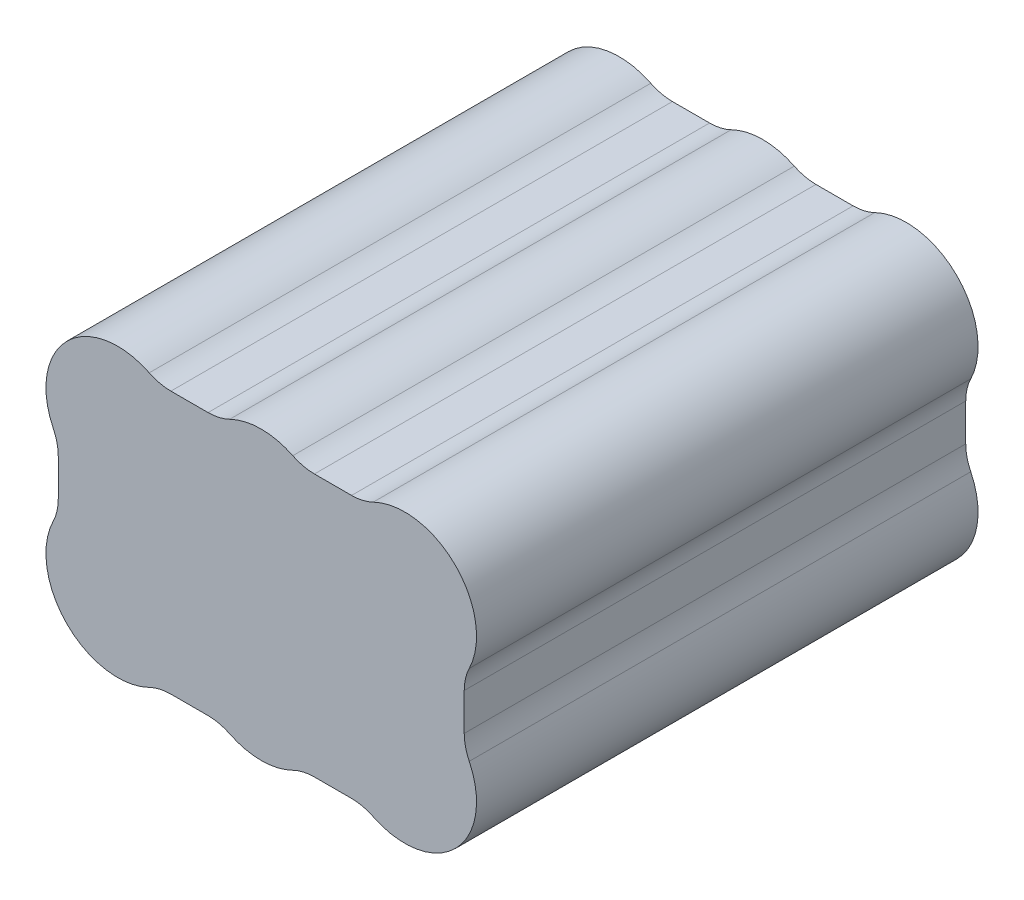
ISO-10303-21;
HEADER;
FILE_DESCRIPTION(('STEP AP214'),'2;1');
FILE_NAME('part.step','',(''),(''),'','','');
FILE_SCHEMA(('AUTOMOTIVE_DESIGN { 1 0 10303 214 1 1 1 1 }'));
ENDSEC;
DATA;
#1=APPLICATION_CONTEXT('core data for automotive mechanical design processes');
#2=APPLICATION_PROTOCOL_DEFINITION('international standard','automotive_design',2000,#1);
#3=PRODUCT_CONTEXT('',#1,'mechanical');
#4=PRODUCT('Part','Part','',(#3));
#5=PRODUCT_RELATED_PRODUCT_CATEGORY('part','',(#4));
#6=PRODUCT_DEFINITION_FORMATION('','',#4);
#7=PRODUCT_DEFINITION_CONTEXT('part definition',#1,'design');
#8=PRODUCT_DEFINITION('design','',#6,#7);
#9=PRODUCT_DEFINITION_SHAPE('','',#8);
#10=(LENGTH_UNIT() NAMED_UNIT(*) SI_UNIT(.MILLI.,.METRE.));
#11=(NAMED_UNIT(*) PLANE_ANGLE_UNIT() SI_UNIT($,.RADIAN.));
#12=(NAMED_UNIT(*) SI_UNIT($,.STERADIAN.) SOLID_ANGLE_UNIT());
#13=UNCERTAINTY_MEASURE_WITH_UNIT(LENGTH_MEASURE(1.E-05),#10,'distance_accuracy_value','');
#14=(GEOMETRIC_REPRESENTATION_CONTEXT(3) GLOBAL_UNCERTAINTY_ASSIGNED_CONTEXT((#13)) GLOBAL_UNIT_ASSIGNED_CONTEXT((#10,
#11,#12)) REPRESENTATION_CONTEXT('',''));
#15=CARTESIAN_POINT('',(0.,0.,0.));
#16=DIRECTION('',(0.,0.,1.));
#17=DIRECTION('',(1.,0.,0.));
#18=AXIS2_PLACEMENT_3D('',#15,#16,#17);
#19=CARTESIAN_POINT('',(3173.91030440519,2839.53220099449,64.6557));
#20=DIRECTION('',(0.,0.,-1.));
#21=DIRECTION('',(-1.,0.,0.));
#22=AXIS2_PLACEMENT_3D('',#19,#20,#21);
#23=CYLINDRICAL_SURFACE('',#22,6.35000000000014);
#24=CARTESIAN_POINT('',(3173.91030440519,2839.53220099449,0.));
#25=DIRECTION('',(0.,0.,-1.));
#26=DIRECTION('',(1.,0.,0.));
#27=AXIS2_PLACEMENT_3D('',#24,#25,#26);
#28=CIRCLE('',#27,6.35000000000014);
#29=CARTESIAN_POINT('',(3173.91030440519,2845.88220099449,0.));
#30=VERTEX_POINT('',#29);
#31=CARTESIAN_POINT('',(3176.70103455306,2845.23608784836,0.));
#32=VERTEX_POINT('',#31);
#33=EDGE_CURVE('E225',#30,#32,#28,.T.);
#34=ORIENTED_EDGE('',*,*,#33,.T.);
#35=DIRECTION('',(0.,0.,-1.));
#36=VECTOR('',#35,1.);
#37=CARTESIAN_POINT('',(3176.70103455306,2845.23608784836,64.6557));
#38=LINE('',#37,#36);
#39=CARTESIAN_POINT('',(3176.70103455306,2845.23608784836,64.6557));
#40=VERTEX_POINT('',#39);
#41=EDGE_CURVE('E11',#40,#32,#38,.T.);
#42=ORIENTED_EDGE('',*,*,#41,.F.);
#43=CARTESIAN_POINT('',(3173.91030440519,2839.53220099449,64.6557));
#44=DIRECTION('',(0.,0.,-1.));
#45=DIRECTION('',(1.,0.,0.));
#46=AXIS2_PLACEMENT_3D('',#43,#44,#45);
#47=CIRCLE('',#46,6.35000000000014);
#48=CARTESIAN_POINT('',(3173.91030440519,2845.88220099449,64.6557));
#49=VERTEX_POINT('',#48);
#50=EDGE_CURVE('E271',#49,#40,#47,.T.);
#51=ORIENTED_EDGE('',*,*,#50,.F.);
#52=DIRECTION('',(0.,0.,-1.));
#53=VECTOR('',#52,1.);
#54=CARTESIAN_POINT('',(3173.91030440519,2845.88220099449,64.6557));
#55=LINE('',#54,#53);
#56=EDGE_CURVE('E221',#49,#30,#55,.T.);
#57=ORIENTED_EDGE('',*,*,#56,.T.);
#58=EDGE_LOOP('',(#34,#42,#51,#57));
#59=FACE_BOUND('',#58,.T.);
#60=ADVANCED_FACE('F33',(#59),#23,.F.);
#61=CARTESIAN_POINT('',(3180.7671283785,2853.54665099446,64.6557));
#62=DIRECTION('',(0.,0.,-1.));
#63=DIRECTION('',(-1.,0.,0.));
#64=AXIS2_PLACEMENT_3D('',#61,#62,#63);
#65=CYLINDRICAL_SURFACE('',#64,9.2519500000007);
#66=CARTESIAN_POINT('',(3180.7671283785,2853.54665099446,0.));
#67=DIRECTION('',(0.,0.,1.));
#68=DIRECTION('',(1.,0.,0.));
#69=AXIS2_PLACEMENT_3D('',#66,#67,#68);
#70=CIRCLE('',#69,9.2519500000007);
#71=CARTESIAN_POINT('',(3189.07769152459,2857.6127448199,0.));
#72=VERTEX_POINT('',#71);
#73=EDGE_CURVE('E228',#32,#72,#70,.T.);
#74=ORIENTED_EDGE('',*,*,#73,.T.);
#75=DIRECTION('',(0.,0.,-1.));
#76=VECTOR('',#75,1.);
#77=CARTESIAN_POINT('',(3189.07769152459,2857.6127448199,64.6557));
#78=LINE('',#77,#76);
#79=CARTESIAN_POINT('',(3189.07769152459,2857.6127448199,64.6557));
#80=VERTEX_POINT('',#79);
#81=EDGE_CURVE('E41',#80,#72,#78,.T.);
#82=ORIENTED_EDGE('',*,*,#81,.F.);
#83=CARTESIAN_POINT('',(3180.7671283785,2853.54665099446,64.6557));
#84=DIRECTION('',(0.,0.,1.));
#85=DIRECTION('',(1.,0.,0.));
#86=AXIS2_PLACEMENT_3D('',#83,#84,#85);
#87=CIRCLE('',#86,9.2519500000007);
#88=EDGE_CURVE('E140',#40,#80,#87,.T.);
#89=ORIENTED_EDGE('',*,*,#88,.F.);
#90=ORIENTED_EDGE('',*,*,#41,.T.);
#91=EDGE_LOOP('',(#74,#82,#89,#90));
#92=FACE_BOUND('',#91,.T.);
#93=ADVANCED_FACE('F409',(#92),#65,.T.);
#94=CARTESIAN_POINT('',(3194.78157837847,2860.40347496777,64.6557));
#95=DIRECTION('',(0.,0.,-1.));
#96=DIRECTION('',(-1.,0.,0.));
#97=AXIS2_PLACEMENT_3D('',#94,#95,#96);
#98=CYLINDRICAL_SURFACE('',#97,6.34999999999982);
#99=CARTESIAN_POINT('',(3194.78157837847,2860.40347496777,0.));
#100=DIRECTION('',(0.,0.,-1.));
#101=DIRECTION('',(1.,0.,0.));
#102=AXIS2_PLACEMENT_3D('',#99,#100,#101);
#103=CIRCLE('',#102,6.34999999999982);
#104=CARTESIAN_POINT('',(3188.43157837847,2860.40347496777,0.));
#105=VERTEX_POINT('',#104);
#106=EDGE_CURVE('E230',#72,#105,#103,.T.);
#107=ORIENTED_EDGE('',*,*,#106,.T.);
#108=DIRECTION('',(0.,0.,-1.));
#109=VECTOR('',#108,1.);
#110=CARTESIAN_POINT('',(3188.43157837847,2860.40347496777,64.6557));
#111=LINE('',#110,#109);
#112=CARTESIAN_POINT('',(3188.43157837847,2860.40347496777,64.6557));
#113=VERTEX_POINT('',#112);
#114=EDGE_CURVE('E326',#113,#105,#111,.T.);
#115=ORIENTED_EDGE('',*,*,#114,.F.);
#116=CARTESIAN_POINT('',(3194.78157837847,2860.40347496777,64.6557));
#117=DIRECTION('',(0.,0.,-1.));
#118=DIRECTION('',(1.,0.,0.));
#119=AXIS2_PLACEMENT_3D('',#116,#117,#118);
#120=CIRCLE('',#119,6.34999999999982);
#121=EDGE_CURVE('E334',#80,#113,#120,.T.);
#122=ORIENTED_EDGE('',*,*,#121,.F.);
#123=ORIENTED_EDGE('',*,*,#81,.T.);
#124=EDGE_LOOP('',(#107,#115,#122,#123));
#125=FACE_BOUND('',#124,.T.);
#126=ADVANCED_FACE('F332',(#125),#98,.F.);
#127=CARTESIAN_POINT('',(3188.43157837847,2860.40347496777,64.6557));
#128=DIRECTION('',(-1.,0.,0.));
#129=DIRECTION('',(0.,-1.,0.));
#130=AXIS2_PLACEMENT_3D('',#127,#128,#129);
#131=PLANE('',#130);
#132=DIRECTION('',(0.,1.,0.));
#133=VECTOR('',#132,1.);
#134=CARTESIAN_POINT('',(3188.43157837847,2860.40347496777,0.));
#135=LINE('',#134,#133);
#136=CARTESIAN_POINT('',(3188.43157837847,2865.19372702114,0.));
#137=VERTEX_POINT('',#136);
#138=EDGE_CURVE('E232',#105,#137,#135,.T.);
#139=ORIENTED_EDGE('',*,*,#138,.T.);
#140=DIRECTION('',(0.,0.,-1.));
#141=VECTOR('',#140,1.);
#142=CARTESIAN_POINT('',(3188.43157837847,2865.19372702114,64.6557));
#143=LINE('',#142,#141);
#144=CARTESIAN_POINT('',(3188.43157837847,2865.19372702114,64.6557));
#145=VERTEX_POINT('',#144);
#146=EDGE_CURVE('E323',#145,#137,#143,.T.);
#147=ORIENTED_EDGE('',*,*,#146,.F.);
#148=DIRECTION('',(0.,1.,0.));
#149=VECTOR('',#148,1.);
#150=CARTESIAN_POINT('',(3188.43157837847,2860.40347496777,64.6557));
#151=LINE('',#150,#149);
#152=EDGE_CURVE('E352',#113,#145,#151,.T.);
#153=ORIENTED_EDGE('',*,*,#152,.F.);
#154=ORIENTED_EDGE('',*,*,#114,.T.);
#155=EDGE_LOOP('',(#139,#147,#153,#154));
#156=FACE_BOUND('',#155,.T.);
#157=ADVANCED_FACE('F343',(#156),#131,.F.);
#158=CARTESIAN_POINT('',(3194.78157837847,2865.19372702114,64.6557));
#159=DIRECTION('',(0.,0.,-1.));
#160=DIRECTION('',(-1.,0.,0.));
#161=AXIS2_PLACEMENT_3D('',#158,#159,#160);
#162=CYLINDRICAL_SURFACE('',#161,6.35000000000002);
#163=CARTESIAN_POINT('',(3194.78157837847,2865.19372702114,0.));
#164=DIRECTION('',(0.,0.,-1.));
#165=DIRECTION('',(1.,0.,0.));
#166=AXIS2_PLACEMENT_3D('',#163,#164,#165);
#167=CIRCLE('',#166,6.35000000000002);
#168=CARTESIAN_POINT('',(3189.07769152459,2867.98445716901,0.));
#169=VERTEX_POINT('',#168);
#170=EDGE_CURVE('E234',#137,#169,#167,.T.);
#171=ORIENTED_EDGE('',*,*,#170,.T.);
#172=DIRECTION('',(0.,0.,-1.));
#173=VECTOR('',#172,1.);
#174=CARTESIAN_POINT('',(3189.07769152459,2867.98445716901,64.6557));
#175=LINE('',#174,#173);
#176=CARTESIAN_POINT('',(3189.07769152459,2867.98445716901,64.6557));
#177=VERTEX_POINT('',#176);
#178=EDGE_CURVE('E320',#177,#169,#175,.T.);
#179=ORIENTED_EDGE('',*,*,#178,.F.);
#180=CARTESIAN_POINT('',(3194.78157837847,2865.19372702114,64.6557));
#181=DIRECTION('',(0.,0.,-1.));
#182=DIRECTION('',(1.,0.,0.));
#183=AXIS2_PLACEMENT_3D('',#180,#181,#182);
#184=CIRCLE('',#183,6.35000000000002);
#185=EDGE_CURVE('E349',#145,#177,#184,.T.);
#186=ORIENTED_EDGE('',*,*,#185,.F.);
#187=ORIENTED_EDGE('',*,*,#146,.T.);
#188=EDGE_LOOP('',(#171,#179,#186,#187));
#189=FACE_BOUND('',#188,.T.);
#190=ADVANCED_FACE('F347',(#189),#162,.F.);
#191=CARTESIAN_POINT('',(3180.7671283785,2872.05055099446,64.6557));
#192=DIRECTION('',(0.,0.,-1.));
#193=DIRECTION('',(-1.,0.,0.));
#194=AXIS2_PLACEMENT_3D('',#191,#192,#193);
#195=CYLINDRICAL_SURFACE('',#194,9.2519500000006);
#196=CARTESIAN_POINT('',(3180.7671283785,2872.05055099446,0.));
#197=DIRECTION('',(0.,0.,1.));
#198=DIRECTION('',(1.,0.,0.));
#199=AXIS2_PLACEMENT_3D('',#196,#197,#198);
#200=CIRCLE('',#199,9.2519500000006);
#201=CARTESIAN_POINT('',(3176.70103455306,2880.36111414055,0.));
#202=VERTEX_POINT('',#201);
#203=EDGE_CURVE('E236',#169,#202,#200,.T.);
#204=ORIENTED_EDGE('',*,*,#203,.T.);
#205=DIRECTION('',(0.,0.,-1.));
#206=VECTOR('',#205,1.);
#207=CARTESIAN_POINT('',(3176.70103455306,2880.36111414055,64.6557));
#208=LINE('',#207,#206);
#209=CARTESIAN_POINT('',(3176.70103455306,2880.36111414055,64.6557));
#210=VERTEX_POINT('',#209);
#211=EDGE_CURVE('E317',#210,#202,#208,.T.);
#212=ORIENTED_EDGE('',*,*,#211,.F.);
#213=CARTESIAN_POINT('',(3180.7671283785,2872.05055099446,64.6557));
#214=DIRECTION('',(0.,0.,1.));
#215=DIRECTION('',(1.,0.,0.));
#216=AXIS2_PLACEMENT_3D('',#213,#214,#215);
#217=CIRCLE('',#216,9.2519500000006);
#218=EDGE_CURVE('E351',#177,#210,#217,.T.);
#219=ORIENTED_EDGE('',*,*,#218,.F.);
#220=ORIENTED_EDGE('',*,*,#178,.T.);
#221=EDGE_LOOP('',(#204,#212,#219,#220));
#222=FACE_BOUND('',#221,.T.);
#223=ADVANCED_FACE('F422',(#222),#195,.T.);
#224=CARTESIAN_POINT('',(3173.91030440519,2886.06500099442,64.6557));
#225=DIRECTION('',(0.,0.,-1.));
#226=DIRECTION('',(-1.,0.,0.));
#227=AXIS2_PLACEMENT_3D('',#224,#225,#226);
#228=CYLINDRICAL_SURFACE('',#227,6.34999999999992);
#229=CARTESIAN_POINT('',(3173.91030440519,2886.06500099442,0.));
#230=DIRECTION('',(0.,0.,-1.));
#231=DIRECTION('',(1.,0.,0.));
#232=AXIS2_PLACEMENT_3D('',#229,#230,#231);
#233=CIRCLE('',#232,6.34999999999992);
#234=CARTESIAN_POINT('',(3173.91030440519,2879.71500099442,0.));
#235=VERTEX_POINT('',#234);
#236=EDGE_CURVE('E238',#202,#235,#233,.T.);
#237=ORIENTED_EDGE('',*,*,#236,.T.);
#238=DIRECTION('',(0.,0.,-1.));
#239=VECTOR('',#238,1.);
#240=CARTESIAN_POINT('',(3173.91030440519,2879.71500099442,64.6557));
#241=LINE('',#240,#239);
#242=CARTESIAN_POINT('',(3173.91030440519,2879.71500099442,64.6557));
#243=VERTEX_POINT('',#242);
#244=EDGE_CURVE('E314',#243,#235,#241,.T.);
#245=ORIENTED_EDGE('',*,*,#244,.F.);
#246=CARTESIAN_POINT('',(3173.91030440519,2886.06500099442,64.6557));
#247=DIRECTION('',(0.,0.,-1.));
#248=DIRECTION('',(1.,0.,0.));
#249=AXIS2_PLACEMENT_3D('',#246,#247,#248);
#250=CIRCLE('',#249,6.34999999999992);
#251=EDGE_CURVE('E354',#210,#243,#250,.T.);
#252=ORIENTED_EDGE('',*,*,#251,.F.);
#253=ORIENTED_EDGE('',*,*,#211,.T.);
#254=EDGE_LOOP('',(#237,#245,#252,#253));
#255=FACE_BOUND('',#254,.T.);
#256=ADVANCED_FACE('F425',(#255),#228,.F.);
#257=CARTESIAN_POINT('',(3169.12005235181,2879.71500099442,64.6557));
#258=DIRECTION('',(0.,-1.,0.));
#259=DIRECTION('',(1.,0.,0.));
#260=AXIS2_PLACEMENT_3D('',#257,#258,#259);
#261=PLANE('',#260);
#262=DIRECTION('',(-1.,0.,0.));
#263=VECTOR('',#262,1.);
#264=CARTESIAN_POINT('',(3169.12005235181,2879.71500099442,0.));
#265=LINE('',#264,#263);
#266=CARTESIAN_POINT('',(3169.12005235181,2879.71500099442,0.));
#267=VERTEX_POINT('',#266);
#268=EDGE_CURVE('E240',#235,#267,#265,.T.);
#269=ORIENTED_EDGE('',*,*,#268,.T.);
#270=DIRECTION('',(0.,0.,-1.));
#271=VECTOR('',#270,1.);
#272=CARTESIAN_POINT('',(3169.12005235181,2879.71500099442,64.6557));
#273=LINE('',#272,#271);
#274=CARTESIAN_POINT('',(3169.12005235181,2879.71500099442,64.6557));
#275=VERTEX_POINT('',#274);
#276=EDGE_CURVE('E311',#275,#267,#273,.T.);
#277=ORIENTED_EDGE('',*,*,#276,.F.);
#278=DIRECTION('',(-1.,0.,0.));
#279=VECTOR('',#278,1.);
#280=CARTESIAN_POINT('',(3169.12005235181,2879.71500099442,64.6557));
#281=LINE('',#280,#279);
#282=EDGE_CURVE('E360',#243,#275,#281,.T.);
#283=ORIENTED_EDGE('',*,*,#282,.F.);
#284=ORIENTED_EDGE('',*,*,#244,.T.);
#285=EDGE_LOOP('',(#269,#277,#283,#284));
#286=FACE_BOUND('',#285,.T.);
#287=ADVANCED_FACE('F429',(#286),#261,.F.);
#288=CARTESIAN_POINT('',(3169.12005235181,2886.06500099442,64.6557));
#289=DIRECTION('',(0.,0.,-1.));
#290=DIRECTION('',(-1.,0.,0.));
#291=AXIS2_PLACEMENT_3D('',#288,#289,#290);
#292=CYLINDRICAL_SURFACE('',#291,6.35000000000024);
#293=CARTESIAN_POINT('',(3169.12005235181,2886.06500099442,0.));
#294=DIRECTION('',(0.,0.,-1.));
#295=DIRECTION('',(1.,0.,0.));
#296=AXIS2_PLACEMENT_3D('',#293,#294,#295);
#297=CIRCLE('',#296,6.35000000000024);
#298=CARTESIAN_POINT('',(3166.32932220395,2880.36111414055,0.));
#299=VERTEX_POINT('',#298);
#300=EDGE_CURVE('E242',#267,#299,#297,.T.);
#301=ORIENTED_EDGE('',*,*,#300,.T.);
#302=DIRECTION('',(0.,0.,-1.));
#303=VECTOR('',#302,1.);
#304=CARTESIAN_POINT('',(3166.32932220395,2880.36111414055,64.6557));
#305=LINE('',#304,#303);
#306=CARTESIAN_POINT('',(3166.32932220395,2880.36111414055,64.6557));
#307=VERTEX_POINT('',#306);
#308=EDGE_CURVE('E308',#307,#299,#305,.T.);
#309=ORIENTED_EDGE('',*,*,#308,.F.);
#310=CARTESIAN_POINT('',(3169.12005235181,2886.06500099442,64.6557));
#311=DIRECTION('',(0.,0.,-1.));
#312=DIRECTION('',(1.,0.,0.));
#313=AXIS2_PLACEMENT_3D('',#310,#311,#312);
#314=CIRCLE('',#313,6.35000000000024);
#315=EDGE_CURVE('E362',#275,#307,#314,.T.);
#316=ORIENTED_EDGE('',*,*,#315,.F.);
#317=ORIENTED_EDGE('',*,*,#276,.T.);
#318=EDGE_LOOP('',(#301,#309,#316,#317));
#319=FACE_BOUND('',#318,.T.);
#320=ADVANCED_FACE('F433',(#319),#292,.F.);
#321=CARTESIAN_POINT('',(3162.2632283785,2872.05055099446,64.6557));
#322=DIRECTION('',(0.,0.,-1.));
#323=DIRECTION('',(-1.,0.,0.));
#324=AXIS2_PLACEMENT_3D('',#321,#322,#323);
#325=CYLINDRICAL_SURFACE('',#324,9.2519500000007);
#326=CARTESIAN_POINT('',(3162.2632283785,2872.05055099446,0.));
#327=DIRECTION('',(0.,0.,1.));
#328=DIRECTION('',(1.,0.,0.));
#329=AXIS2_PLACEMENT_3D('',#326,#327,#328);
#330=CIRCLE('',#329,9.2519500000007);
#331=CARTESIAN_POINT('',(3158.19713455306,2880.36111414055,0.));
#332=VERTEX_POINT('',#331);
#333=EDGE_CURVE('E244',#299,#332,#330,.T.);
#334=ORIENTED_EDGE('',*,*,#333,.T.);
#335=DIRECTION('',(0.,0.,-1.));
#336=VECTOR('',#335,1.);
#337=CARTESIAN_POINT('',(3158.19713455306,2880.36111414055,64.6557));
#338=LINE('',#337,#336);
#339=CARTESIAN_POINT('',(3158.19713455306,2880.36111414055,64.6557));
#340=VERTEX_POINT('',#339);
#341=EDGE_CURVE('E305',#340,#332,#338,.T.);
#342=ORIENTED_EDGE('',*,*,#341,.F.);
#343=CARTESIAN_POINT('',(3162.2632283785,2872.05055099446,64.6557));
#344=DIRECTION('',(0.,0.,1.));
#345=DIRECTION('',(1.,0.,0.));
#346=AXIS2_PLACEMENT_3D('',#343,#344,#345);
#347=CIRCLE('',#346,9.2519500000007);
#348=EDGE_CURVE('E364',#307,#340,#347,.T.);
#349=ORIENTED_EDGE('',*,*,#348,.F.);
#350=ORIENTED_EDGE('',*,*,#308,.T.);
#351=EDGE_LOOP('',(#334,#342,#349,#350));
#352=FACE_BOUND('',#351,.T.);
#353=ADVANCED_FACE('F437',(#352),#325,.T.);
#354=CARTESIAN_POINT('',(3155.40640440519,2886.06500099442,64.6557));
#355=DIRECTION('',(0.,0.,-1.));
#356=DIRECTION('',(-1.,0.,0.));
#357=AXIS2_PLACEMENT_3D('',#354,#355,#356);
#358=CYLINDRICAL_SURFACE('',#357,6.34999999999992);
#359=CARTESIAN_POINT('',(3155.40640440519,2886.06500099442,0.));
#360=DIRECTION('',(0.,0.,-1.));
#361=DIRECTION('',(1.,0.,0.));
#362=AXIS2_PLACEMENT_3D('',#359,#360,#361);
#363=CIRCLE('',#362,6.34999999999992);
#364=CARTESIAN_POINT('',(3155.40640440519,2879.71500099442,0.));
#365=VERTEX_POINT('',#364);
#366=EDGE_CURVE('E246',#332,#365,#363,.T.);
#367=ORIENTED_EDGE('',*,*,#366,.T.);
#368=DIRECTION('',(0.,0.,-1.));
#369=VECTOR('',#368,1.);
#370=CARTESIAN_POINT('',(3155.40640440519,2879.71500099442,64.6557));
#371=LINE('',#370,#369);
#372=CARTESIAN_POINT('',(3155.40640440519,2879.71500099442,64.6557));
#373=VERTEX_POINT('',#372);
#374=EDGE_CURVE('E302',#373,#365,#371,.T.);
#375=ORIENTED_EDGE('',*,*,#374,.F.);
#376=CARTESIAN_POINT('',(3155.40640440519,2886.06500099442,64.6557));
#377=DIRECTION('',(0.,0.,-1.));
#378=DIRECTION('',(1.,0.,0.));
#379=AXIS2_PLACEMENT_3D('',#376,#377,#378);
#380=CIRCLE('',#379,6.34999999999992);
#381=EDGE_CURVE('E366',#340,#373,#380,.T.);
#382=ORIENTED_EDGE('',*,*,#381,.F.);
#383=ORIENTED_EDGE('',*,*,#341,.T.);
#384=EDGE_LOOP('',(#367,#375,#382,#383));
#385=FACE_BOUND('',#384,.T.);
#386=ADVANCED_FACE('F441',(#385),#358,.F.);
#387=CARTESIAN_POINT('',(3150.61615235181,2879.71500099442,64.6557));
#388=DIRECTION('',(0.,-1.,0.));
#389=DIRECTION('',(1.,0.,0.));
#390=AXIS2_PLACEMENT_3D('',#387,#388,#389);
#391=PLANE('',#390);
#392=DIRECTION('',(-1.,0.,0.));
#393=VECTOR('',#392,1.);
#394=CARTESIAN_POINT('',(3150.61615235181,2879.71500099442,0.));
#395=LINE('',#394,#393);
#396=CARTESIAN_POINT('',(3150.61615235181,2879.71500099442,0.));
#397=VERTEX_POINT('',#396);
#398=EDGE_CURVE('E248',#365,#397,#395,.T.);
#399=ORIENTED_EDGE('',*,*,#398,.T.);
#400=DIRECTION('',(0.,0.,-1.));
#401=VECTOR('',#400,1.);
#402=CARTESIAN_POINT('',(3150.61615235181,2879.71500099442,64.6557));
#403=LINE('',#402,#401);
#404=CARTESIAN_POINT('',(3150.61615235181,2879.71500099442,64.6557));
#405=VERTEX_POINT('',#404);
#406=EDGE_CURVE('E299',#405,#397,#403,.T.);
#407=ORIENTED_EDGE('',*,*,#406,.F.);
#408=DIRECTION('',(-1.,0.,0.));
#409=VECTOR('',#408,1.);
#410=CARTESIAN_POINT('',(3150.61615235181,2879.71500099442,64.6557));
#411=LINE('',#410,#409);
#412=EDGE_CURVE('E368',#373,#405,#411,.T.);
#413=ORIENTED_EDGE('',*,*,#412,.F.);
#414=ORIENTED_EDGE('',*,*,#374,.T.);
#415=EDGE_LOOP('',(#399,#407,#413,#414));
#416=FACE_BOUND('',#415,.T.);
#417=ADVANCED_FACE('F445',(#416),#391,.F.);
#418=CARTESIAN_POINT('',(3150.61615235181,2886.06500099442,64.6557));
#419=DIRECTION('',(0.,0.,-1.));
#420=DIRECTION('',(-1.,0.,0.));
#421=AXIS2_PLACEMENT_3D('',#418,#419,#420);
#422=CYLINDRICAL_SURFACE('',#421,6.35000000000024);
#423=CARTESIAN_POINT('',(3150.61615235181,2886.06500099442,0.));
#424=DIRECTION('',(0.,0.,-1.));
#425=DIRECTION('',(1.,0.,0.));
#426=AXIS2_PLACEMENT_3D('',#423,#424,#425);
#427=CIRCLE('',#426,6.35000000000024);
#428=CARTESIAN_POINT('',(3147.82542220394,2880.36111414055,0.));
#429=VERTEX_POINT('',#428);
#430=EDGE_CURVE('E250',#397,#429,#427,.T.);
#431=ORIENTED_EDGE('',*,*,#430,.T.);
#432=DIRECTION('',(0.,0.,-1.));
#433=VECTOR('',#432,1.);
#434=CARTESIAN_POINT('',(3147.82542220394,2880.36111414055,64.6557));
#435=LINE('',#434,#433);
#436=CARTESIAN_POINT('',(3147.82542220394,2880.36111414055,64.6557));
#437=VERTEX_POINT('',#436);
#438=EDGE_CURVE('E296',#437,#429,#435,.T.);
#439=ORIENTED_EDGE('',*,*,#438,.F.);
#440=CARTESIAN_POINT('',(3150.61615235181,2886.06500099442,64.6557));
#441=DIRECTION('',(0.,0.,-1.));
#442=DIRECTION('',(1.,0.,0.));
#443=AXIS2_PLACEMENT_3D('',#440,#441,#442);
#444=CIRCLE('',#443,6.35000000000024);
#445=EDGE_CURVE('E370',#405,#437,#444,.T.);
#446=ORIENTED_EDGE('',*,*,#445,.F.);
#447=ORIENTED_EDGE('',*,*,#406,.T.);
#448=EDGE_LOOP('',(#431,#439,#446,#447));
#449=FACE_BOUND('',#448,.T.);
#450=ADVANCED_FACE('F449',(#449),#422,.F.);
#451=CARTESIAN_POINT('',(3143.7593283785,2872.05055099446,64.6557));
#452=DIRECTION('',(0.,0.,-1.));
#453=DIRECTION('',(-1.,0.,0.));
#454=AXIS2_PLACEMENT_3D('',#451,#452,#453);
#455=CYLINDRICAL_SURFACE('',#454,9.2519500000006);
#456=CARTESIAN_POINT('',(3143.7593283785,2872.05055099446,0.));
#457=DIRECTION('',(0.,0.,1.));
#458=DIRECTION('',(1.,0.,0.));
#459=AXIS2_PLACEMENT_3D('',#456,#457,#458);
#460=CIRCLE('',#459,9.2519500000006);
#461=CARTESIAN_POINT('',(3135.44876523241,2867.98445716901,0.));
#462=VERTEX_POINT('',#461);
#463=EDGE_CURVE('E252',#429,#462,#460,.T.);
#464=ORIENTED_EDGE('',*,*,#463,.T.);
#465=DIRECTION('',(0.,0.,-1.));
#466=VECTOR('',#465,1.);
#467=CARTESIAN_POINT('',(3135.44876523241,2867.98445716901,64.6557));
#468=LINE('',#467,#466);
#469=CARTESIAN_POINT('',(3135.44876523241,2867.98445716901,64.6557));
#470=VERTEX_POINT('',#469);
#471=EDGE_CURVE('E293',#470,#462,#468,.T.);
#472=ORIENTED_EDGE('',*,*,#471,.F.);
#473=CARTESIAN_POINT('',(3143.7593283785,2872.05055099446,64.6557));
#474=DIRECTION('',(0.,0.,1.));
#475=DIRECTION('',(1.,0.,0.));
#476=AXIS2_PLACEMENT_3D('',#473,#474,#475);
#477=CIRCLE('',#476,9.2519500000006);
#478=EDGE_CURVE('E372',#437,#470,#477,.T.);
#479=ORIENTED_EDGE('',*,*,#478,.F.);
#480=ORIENTED_EDGE('',*,*,#438,.T.);
#481=EDGE_LOOP('',(#464,#472,#479,#480));
#482=FACE_BOUND('',#481,.T.);
#483=ADVANCED_FACE('F453',(#482),#455,.T.);
#484=CARTESIAN_POINT('',(3129.74487837853,2865.19372702114,64.6557));
#485=DIRECTION('',(0.,0.,-1.));
#486=DIRECTION('',(-1.,0.,0.));
#487=AXIS2_PLACEMENT_3D('',#484,#485,#486);
#488=CYLINDRICAL_SURFACE('',#487,6.35000000000034);
#489=CARTESIAN_POINT('',(3129.74487837853,2865.19372702114,0.));
#490=DIRECTION('',(0.,0.,-1.));
#491=DIRECTION('',(1.,0.,0.));
#492=AXIS2_PLACEMENT_3D('',#489,#490,#491);
#493=CIRCLE('',#492,6.35000000000034);
#494=CARTESIAN_POINT('',(3136.09487837853,2865.19372702114,0.));
#495=VERTEX_POINT('',#494);
#496=EDGE_CURVE('E254',#462,#495,#493,.T.);
#497=ORIENTED_EDGE('',*,*,#496,.T.);
#498=DIRECTION('',(0.,0.,-1.));
#499=VECTOR('',#498,1.);
#500=CARTESIAN_POINT('',(3136.09487837853,2865.19372702114,64.6557));
#501=LINE('',#500,#499);
#502=CARTESIAN_POINT('',(3136.09487837853,2865.19372702114,64.6557));
#503=VERTEX_POINT('',#502);
#504=EDGE_CURVE('E290',#503,#495,#501,.T.);
#505=ORIENTED_EDGE('',*,*,#504,.F.);
#506=CARTESIAN_POINT('',(3129.74487837853,2865.19372702114,64.6557));
#507=DIRECTION('',(0.,0.,-1.));
#508=DIRECTION('',(1.,0.,0.));
#509=AXIS2_PLACEMENT_3D('',#506,#507,#508);
#510=CIRCLE('',#509,6.35000000000034);
#511=EDGE_CURVE('E374',#470,#503,#510,.T.);
#512=ORIENTED_EDGE('',*,*,#511,.F.);
#513=ORIENTED_EDGE('',*,*,#471,.T.);
#514=EDGE_LOOP('',(#497,#505,#512,#513));
#515=FACE_BOUND('',#514,.T.);
#516=ADVANCED_FACE('F457',(#515),#488,.F.);
#517=CARTESIAN_POINT('',(3136.09487837853,2860.40347496777,64.6557));
#518=DIRECTION('',(1.,0.,0.));
#519=DIRECTION('',(0.,1.,0.));
#520=AXIS2_PLACEMENT_3D('',#517,#518,#519);
#521=PLANE('',#520);
#522=DIRECTION('',(0.,-1.,0.));
#523=VECTOR('',#522,1.);
#524=CARTESIAN_POINT('',(3136.09487837853,2860.40347496777,0.));
#525=LINE('',#524,#523);
#526=CARTESIAN_POINT('',(3136.09487837853,2860.40347496777,0.));
#527=VERTEX_POINT('',#526);
#528=EDGE_CURVE('E256',#495,#527,#525,.T.);
#529=ORIENTED_EDGE('',*,*,#528,.T.);
#530=DIRECTION('',(0.,0.,-1.));
#531=VECTOR('',#530,1.);
#532=CARTESIAN_POINT('',(3136.09487837853,2860.40347496777,64.6557));
#533=LINE('',#532,#531);
#534=CARTESIAN_POINT('',(3136.09487837853,2860.40347496777,64.6557));
#535=VERTEX_POINT('',#534);
#536=EDGE_CURVE('E287',#535,#527,#533,.T.);
#537=ORIENTED_EDGE('',*,*,#536,.F.);
#538=DIRECTION('',(0.,-1.,0.));
#539=VECTOR('',#538,1.);
#540=CARTESIAN_POINT('',(3136.09487837853,2860.40347496777,64.6557));
#541=LINE('',#540,#539);
#542=EDGE_CURVE('E376',#503,#535,#541,.T.);
#543=ORIENTED_EDGE('',*,*,#542,.F.);
#544=ORIENTED_EDGE('',*,*,#504,.T.);
#545=EDGE_LOOP('',(#529,#537,#543,#544));
#546=FACE_BOUND('',#545,.T.);
#547=ADVANCED_FACE('F461',(#546),#521,.F.);
#548=CARTESIAN_POINT('',(3129.74487837853,2860.40347496777,64.6557));
#549=DIRECTION('',(0.,0.,-1.));
#550=DIRECTION('',(-1.,0.,0.));
#551=AXIS2_PLACEMENT_3D('',#548,#549,#550);
#552=CYLINDRICAL_SURFACE('',#551,6.35000000000024);
#553=CARTESIAN_POINT('',(3129.74487837853,2860.40347496777,0.));
#554=DIRECTION('',(0.,0.,-1.));
#555=DIRECTION('',(1.,0.,0.));
#556=AXIS2_PLACEMENT_3D('',#553,#554,#555);
#557=CIRCLE('',#556,6.35000000000024);
#558=CARTESIAN_POINT('',(3135.44876523241,2857.6127448199,0.));
#559=VERTEX_POINT('',#558);
#560=EDGE_CURVE('E258',#527,#559,#557,.T.);
#561=ORIENTED_EDGE('',*,*,#560,.T.);
#562=DIRECTION('',(0.,0.,-1.));
#563=VECTOR('',#562,1.);
#564=CARTESIAN_POINT('',(3135.44876523241,2857.6127448199,64.6557));
#565=LINE('',#564,#563);
#566=CARTESIAN_POINT('',(3135.44876523241,2857.6127448199,64.6557));
#567=VERTEX_POINT('',#566);
#568=EDGE_CURVE('E284',#567,#559,#565,.T.);
#569=ORIENTED_EDGE('',*,*,#568,.F.);
#570=CARTESIAN_POINT('',(3129.74487837853,2860.40347496777,64.6557));
#571=DIRECTION('',(0.,0.,-1.));
#572=DIRECTION('',(1.,0.,0.));
#573=AXIS2_PLACEMENT_3D('',#570,#571,#572);
#574=CIRCLE('',#573,6.35000000000024);
#575=EDGE_CURVE('E378',#535,#567,#574,.T.);
#576=ORIENTED_EDGE('',*,*,#575,.F.);
#577=ORIENTED_EDGE('',*,*,#536,.T.);
#578=EDGE_LOOP('',(#561,#569,#576,#577));
#579=FACE_BOUND('',#578,.T.);
#580=ADVANCED_FACE('F465',(#579),#552,.F.);
#581=CARTESIAN_POINT('',(3143.7593283785,2853.54665099446,64.6557));
#582=DIRECTION('',(0.,0.,-1.));
#583=DIRECTION('',(-1.,0.,0.));
#584=AXIS2_PLACEMENT_3D('',#581,#582,#583);
#585=CYLINDRICAL_SURFACE('',#584,9.2519500000005);
#586=CARTESIAN_POINT('',(3143.7593283785,2853.54665099446,0.));
#587=DIRECTION('',(0.,0.,1.));
#588=DIRECTION('',(1.,0.,0.));
#589=AXIS2_PLACEMENT_3D('',#586,#587,#588);
#590=CIRCLE('',#589,9.2519500000005);
#591=CARTESIAN_POINT('',(3147.82542220394,2845.23608784836,0.));
#592=VERTEX_POINT('',#591);
#593=EDGE_CURVE('E260',#559,#592,#590,.T.);
#594=ORIENTED_EDGE('',*,*,#593,.T.);
#595=DIRECTION('',(0.,0.,-1.));
#596=VECTOR('',#595,1.);
#597=CARTESIAN_POINT('',(3147.82542220394,2845.23608784836,64.6557));
#598=LINE('',#597,#596);
#599=CARTESIAN_POINT('',(3147.82542220394,2845.23608784836,64.6557));
#600=VERTEX_POINT('',#599);
#601=EDGE_CURVE('E281',#600,#592,#598,.T.);
#602=ORIENTED_EDGE('',*,*,#601,.F.);
#603=CARTESIAN_POINT('',(3143.7593283785,2853.54665099446,64.6557));
#604=DIRECTION('',(0.,0.,1.));
#605=DIRECTION('',(1.,0.,0.));
#606=AXIS2_PLACEMENT_3D('',#603,#604,#605);
#607=CIRCLE('',#606,9.2519500000005);
#608=EDGE_CURVE('E380',#567,#600,#607,.T.);
#609=ORIENTED_EDGE('',*,*,#608,.F.);
#610=ORIENTED_EDGE('',*,*,#568,.T.);
#611=EDGE_LOOP('',(#594,#602,#609,#610));
#612=FACE_BOUND('',#611,.T.);
#613=ADVANCED_FACE('F469',(#612),#585,.T.);
#614=CARTESIAN_POINT('',(3150.61615235181,2839.53220099449,64.6557));
#615=DIRECTION('',(0.,0.,-1.));
#616=DIRECTION('',(-1.,0.,0.));
#617=AXIS2_PLACEMENT_3D('',#614,#615,#616);
#618=CYLINDRICAL_SURFACE('',#617,6.35000000000002);
#619=CARTESIAN_POINT('',(3150.61615235181,2839.53220099449,0.));
#620=DIRECTION('',(0.,0.,-1.));
#621=DIRECTION('',(1.,0.,0.));
#622=AXIS2_PLACEMENT_3D('',#619,#620,#621);
#623=CIRCLE('',#622,6.35000000000002);
#624=CARTESIAN_POINT('',(3150.61615235181,2845.88220099449,0.));
#625=VERTEX_POINT('',#624);
#626=EDGE_CURVE('E262',#592,#625,#623,.T.);
#627=ORIENTED_EDGE('',*,*,#626,.T.);
#628=DIRECTION('',(0.,0.,-1.));
#629=VECTOR('',#628,1.);
#630=CARTESIAN_POINT('',(3150.61615235181,2845.88220099449,64.6557));
#631=LINE('',#630,#629);
#632=CARTESIAN_POINT('',(3150.61615235181,2845.88220099449,64.6557));
#633=VERTEX_POINT('',#632);
#634=EDGE_CURVE('E278',#633,#625,#631,.T.);
#635=ORIENTED_EDGE('',*,*,#634,.F.);
#636=CARTESIAN_POINT('',(3150.61615235181,2839.53220099449,64.6557));
#637=DIRECTION('',(0.,0.,-1.));
#638=DIRECTION('',(1.,0.,0.));
#639=AXIS2_PLACEMENT_3D('',#636,#637,#638);
#640=CIRCLE('',#639,6.35000000000002);
#641=EDGE_CURVE('E382',#600,#633,#640,.T.);
#642=ORIENTED_EDGE('',*,*,#641,.F.);
#643=ORIENTED_EDGE('',*,*,#601,.T.);
#644=EDGE_LOOP('',(#627,#635,#642,#643));
#645=FACE_BOUND('',#644,.T.);
#646=ADVANCED_FACE('F473',(#645),#618,.F.);
#647=CARTESIAN_POINT('',(3150.61615235181,2845.88220099449,64.6557));
#648=DIRECTION('',(0.,1.,0.));
#649=DIRECTION('',(0.,0.,1.));
#650=AXIS2_PLACEMENT_3D('',#647,#648,#649);
#651=PLANE('',#650);
#652=DIRECTION('',(1.,0.,0.));
#653=VECTOR('',#652,1.);
#654=CARTESIAN_POINT('',(3150.61615235181,2845.88220099449,0.));
#655=LINE('',#654,#653);
#656=CARTESIAN_POINT('',(3155.40640440519,2845.88220099449,0.));
#657=VERTEX_POINT('',#656);
#658=EDGE_CURVE('E264',#625,#657,#655,.T.);
#659=ORIENTED_EDGE('',*,*,#658,.T.);
#660=DIRECTION('',(0.,0.,-1.));
#661=VECTOR('',#660,1.);
#662=CARTESIAN_POINT('',(3155.40640440519,2845.88220099449,64.6557));
#663=LINE('',#662,#661);
#664=CARTESIAN_POINT('',(3155.40640440519,2845.88220099449,64.6557));
#665=VERTEX_POINT('',#664);
#666=EDGE_CURVE('E275',#665,#657,#663,.T.);
#667=ORIENTED_EDGE('',*,*,#666,.F.);
#668=DIRECTION('',(1.,0.,0.));
#669=VECTOR('',#668,1.);
#670=CARTESIAN_POINT('',(3150.61615235181,2845.88220099449,64.6557));
#671=LINE('',#670,#669);
#672=EDGE_CURVE('E384',#633,#665,#671,.T.);
#673=ORIENTED_EDGE('',*,*,#672,.F.);
#674=ORIENTED_EDGE('',*,*,#634,.T.);
#675=EDGE_LOOP('',(#659,#667,#673,#674));
#676=FACE_BOUND('',#675,.T.);
#677=ADVANCED_FACE('F390',(#676),#651,.F.);
#678=CARTESIAN_POINT('',(3155.40640440519,2839.53220099449,64.6557));
#679=DIRECTION('',(0.,0.,-1.));
#680=DIRECTION('',(-1.,0.,0.));
#681=AXIS2_PLACEMENT_3D('',#678,#679,#680);
#682=CYLINDRICAL_SURFACE('',#681,6.35000000000014);
#683=CARTESIAN_POINT('',(3155.40640440519,2839.53220099449,0.));
#684=DIRECTION('',(0.,0.,-1.));
#685=DIRECTION('',(1.,0.,0.));
#686=AXIS2_PLACEMENT_3D('',#683,#684,#685);
#687=CIRCLE('',#686,6.35000000000014);
#688=CARTESIAN_POINT('',(3158.19713455306,2845.23608784836,0.));
#689=VERTEX_POINT('',#688);
#690=EDGE_CURVE('E266',#657,#689,#687,.T.);
#691=ORIENTED_EDGE('',*,*,#690,.T.);
#692=DIRECTION('',(0.,0.,-1.));
#693=VECTOR('',#692,1.);
#694=CARTESIAN_POINT('',(3158.19713455306,2845.23608784836,64.6557));
#695=LINE('',#694,#693);
#696=CARTESIAN_POINT('',(3158.19713455306,2845.23608784836,64.6557));
#697=VERTEX_POINT('',#696);
#698=EDGE_CURVE('E216',#697,#689,#695,.T.);
#699=ORIENTED_EDGE('',*,*,#698,.F.);
#700=CARTESIAN_POINT('',(3155.40640440519,2839.53220099449,64.6557));
#701=DIRECTION('',(0.,0.,-1.));
#702=DIRECTION('',(1.,0.,0.));
#703=AXIS2_PLACEMENT_3D('',#700,#701,#702);
#704=CIRCLE('',#703,6.35000000000014);
#705=EDGE_CURVE('E207',#665,#697,#704,.T.);
#706=ORIENTED_EDGE('',*,*,#705,.F.);
#707=ORIENTED_EDGE('',*,*,#666,.T.);
#708=EDGE_LOOP('',(#691,#699,#706,#707));
#709=FACE_BOUND('',#708,.T.);
#710=ADVANCED_FACE('F394',(#709),#682,.F.);
#711=CARTESIAN_POINT('',(3162.2632283785,2853.54665099446,64.6557));
#712=DIRECTION('',(0.,0.,-1.));
#713=DIRECTION('',(-1.,0.,0.));
#714=AXIS2_PLACEMENT_3D('',#711,#712,#713);
#715=CYLINDRICAL_SURFACE('',#714,9.2519500000007);
#716=CARTESIAN_POINT('',(3162.2632283785,2853.54665099446,0.));
#717=DIRECTION('',(0.,0.,1.));
#718=DIRECTION('',(1.,0.,0.));
#719=AXIS2_PLACEMENT_3D('',#716,#717,#718);
#720=CIRCLE('',#719,9.2519500000007);
#721=CARTESIAN_POINT('',(3166.32932220395,2845.23608784836,0.));
#722=VERTEX_POINT('',#721);
#723=EDGE_CURVE('E215',#689,#722,#720,.T.);
#724=ORIENTED_EDGE('',*,*,#723,.T.);
#725=DIRECTION('',(0.,0.,-1.));
#726=VECTOR('',#725,1.);
#727=CARTESIAN_POINT('',(3166.32932220395,2845.23608784836,64.6557));
#728=LINE('',#727,#726);
#729=CARTESIAN_POINT('',(3166.32932220395,2845.23608784836,64.6557));
#730=VERTEX_POINT('',#729);
#731=EDGE_CURVE('E212',#730,#722,#728,.T.);
#732=ORIENTED_EDGE('',*,*,#731,.F.);
#733=CARTESIAN_POINT('',(3162.2632283785,2853.54665099446,64.6557));
#734=DIRECTION('',(0.,0.,1.));
#735=DIRECTION('',(1.,0.,0.));
#736=AXIS2_PLACEMENT_3D('',#733,#734,#735);
#737=CIRCLE('',#736,9.2519500000007);
#738=EDGE_CURVE('E201',#697,#730,#737,.T.);
#739=ORIENTED_EDGE('',*,*,#738,.F.);
#740=ORIENTED_EDGE('',*,*,#698,.T.);
#741=EDGE_LOOP('',(#724,#732,#739,#740));
#742=FACE_BOUND('',#741,.T.);
#743=ADVANCED_FACE('F213',(#742),#715,.T.);
#744=CARTESIAN_POINT('',(3169.12005235181,2839.53220099449,64.6557));
#745=DIRECTION('',(0.,0.,-1.));
#746=DIRECTION('',(-1.,0.,0.));
#747=AXIS2_PLACEMENT_3D('',#744,#745,#746);
#748=CYLINDRICAL_SURFACE('',#747,6.35000000000002);
#749=CARTESIAN_POINT('',(3169.12005235181,2839.53220099449,0.));
#750=DIRECTION('',(0.,0.,-1.));
#751=DIRECTION('',(1.,0.,0.));
#752=AXIS2_PLACEMENT_3D('',#749,#750,#751);
#753=CIRCLE('',#752,6.35000000000002);
#754=CARTESIAN_POINT('',(3169.12005235181,2845.88220099449,0.));
#755=VERTEX_POINT('',#754);
#756=EDGE_CURVE('E126',#722,#755,#753,.T.);
#757=ORIENTED_EDGE('',*,*,#756,.T.);
#758=DIRECTION('',(0.,0.,-1.));
#759=VECTOR('',#758,1.);
#760=CARTESIAN_POINT('',(3169.12005235181,2845.88220099449,64.6557));
#761=LINE('',#760,#759);
#762=CARTESIAN_POINT('',(3169.12005235181,2845.88220099449,64.6557));
#763=VERTEX_POINT('',#762);
#764=EDGE_CURVE('E217',#763,#755,#761,.T.);
#765=ORIENTED_EDGE('',*,*,#764,.F.);
#766=CARTESIAN_POINT('',(3169.12005235181,2839.53220099449,64.6557));
#767=DIRECTION('',(0.,0.,-1.));
#768=DIRECTION('',(1.,0.,0.));
#769=AXIS2_PLACEMENT_3D('',#766,#767,#768);
#770=CIRCLE('',#769,6.35000000000002);
#771=EDGE_CURVE('E205',#730,#763,#770,.T.);
#772=ORIENTED_EDGE('',*,*,#771,.F.);
#773=ORIENTED_EDGE('',*,*,#731,.T.);
#774=EDGE_LOOP('',(#757,#765,#772,#773));
#775=FACE_BOUND('',#774,.T.);
#776=ADVANCED_FACE('F219',(#775),#748,.F.);
#777=CARTESIAN_POINT('',(3169.12005235181,2845.88220099449,64.6557));
#778=DIRECTION('',(0.,1.,0.));
#779=DIRECTION('',(0.,0.,1.));
#780=AXIS2_PLACEMENT_3D('',#777,#778,#779);
#781=PLANE('',#780);
#782=DIRECTION('',(1.,0.,0.));
#783=VECTOR('',#782,1.);
#784=CARTESIAN_POINT('',(3169.12005235181,2845.88220099449,0.));
#785=LINE('',#784,#783);
#786=EDGE_CURVE('E132',#755,#30,#785,.T.);
#787=ORIENTED_EDGE('',*,*,#786,.T.);
#788=ORIENTED_EDGE('',*,*,#56,.F.);
#789=DIRECTION('',(1.,0.,0.));
#790=VECTOR('',#789,1.);
#791=CARTESIAN_POINT('',(3169.12005235181,2845.88220099449,64.6557));
#792=LINE('',#791,#790);
#793=EDGE_CURVE('E49',#763,#49,#792,.T.);
#794=ORIENTED_EDGE('',*,*,#793,.F.);
#795=ORIENTED_EDGE('',*,*,#764,.T.);
#796=EDGE_LOOP('',(#787,#788,#794,#795));
#797=FACE_BOUND('',#796,.T.);
#798=ADVANCED_FACE('F398',(#797),#781,.F.);
#799=CARTESIAN_POINT('',(3173.91030440519,2839.53220099449,64.6557));
#800=DIRECTION('',(0.,0.,1.));
#801=DIRECTION('',(1.,0.,0.));
#802=AXIS2_PLACEMENT_3D('',#799,#800,#801);
#803=PLANE('',#802);
#804=ORIENTED_EDGE('',*,*,#50,.T.);
#805=ORIENTED_EDGE('',*,*,#88,.T.);
#806=ORIENTED_EDGE('',*,*,#121,.T.);
#807=ORIENTED_EDGE('',*,*,#152,.T.);
#808=ORIENTED_EDGE('',*,*,#185,.T.);
#809=ORIENTED_EDGE('',*,*,#218,.T.);
#810=ORIENTED_EDGE('',*,*,#251,.T.);
#811=ORIENTED_EDGE('',*,*,#282,.T.);
#812=ORIENTED_EDGE('',*,*,#315,.T.);
#813=ORIENTED_EDGE('',*,*,#348,.T.);
#814=ORIENTED_EDGE('',*,*,#381,.T.);
#815=ORIENTED_EDGE('',*,*,#412,.T.);
#816=ORIENTED_EDGE('',*,*,#445,.T.);
#817=ORIENTED_EDGE('',*,*,#478,.T.);
#818=ORIENTED_EDGE('',*,*,#511,.T.);
#819=ORIENTED_EDGE('',*,*,#542,.T.);
#820=ORIENTED_EDGE('',*,*,#575,.T.);
#821=ORIENTED_EDGE('',*,*,#608,.T.);
#822=ORIENTED_EDGE('',*,*,#641,.T.);
#823=ORIENTED_EDGE('',*,*,#672,.T.);
#824=ORIENTED_EDGE('',*,*,#705,.T.);
#825=ORIENTED_EDGE('',*,*,#738,.T.);
#826=ORIENTED_EDGE('',*,*,#771,.T.);
#827=ORIENTED_EDGE('',*,*,#793,.T.);
#828=EDGE_LOOP('',(#804,#805,#806,#807,#808,#809,#810,#811,#812,#813,#814,#815,#816,#817,#818,
#819,#820,#821,#822,#823,#824,#825,#826,#827));
#829=FACE_BOUND('',#828,.T.);
#830=ADVANCED_FACE('F203',(#829),#803,.T.);
#831=CARTESIAN_POINT('',(3173.91030440519,2839.53220099449,0.));
#832=DIRECTION('',(0.,0.,1.));
#833=DIRECTION('',(1.,0.,0.));
#834=AXIS2_PLACEMENT_3D('',#831,#832,#833);
#835=PLANE('',#834);
#836=ORIENTED_EDGE('',*,*,#33,.F.);
#837=ORIENTED_EDGE('',*,*,#786,.F.);
#838=ORIENTED_EDGE('',*,*,#756,.F.);
#839=ORIENTED_EDGE('',*,*,#723,.F.);
#840=ORIENTED_EDGE('',*,*,#690,.F.);
#841=ORIENTED_EDGE('',*,*,#658,.F.);
#842=ORIENTED_EDGE('',*,*,#626,.F.);
#843=ORIENTED_EDGE('',*,*,#593,.F.);
#844=ORIENTED_EDGE('',*,*,#560,.F.);
#845=ORIENTED_EDGE('',*,*,#528,.F.);
#846=ORIENTED_EDGE('',*,*,#496,.F.);
#847=ORIENTED_EDGE('',*,*,#463,.F.);
#848=ORIENTED_EDGE('',*,*,#430,.F.);
#849=ORIENTED_EDGE('',*,*,#398,.F.);
#850=ORIENTED_EDGE('',*,*,#366,.F.);
#851=ORIENTED_EDGE('',*,*,#333,.F.);
#852=ORIENTED_EDGE('',*,*,#300,.F.);
#853=ORIENTED_EDGE('',*,*,#268,.F.);
#854=ORIENTED_EDGE('',*,*,#236,.F.);
#855=ORIENTED_EDGE('',*,*,#203,.F.);
#856=ORIENTED_EDGE('',*,*,#170,.F.);
#857=ORIENTED_EDGE('',*,*,#138,.F.);
#858=ORIENTED_EDGE('',*,*,#106,.F.);
#859=ORIENTED_EDGE('',*,*,#73,.F.);
#860=EDGE_LOOP('',(#836,#837,#838,#839,#840,#841,#842,#843,#844,#845,#846,#847,#848,#849,#850,
#851,#852,#853,#854,#855,#856,#857,#858,#859));
#861=FACE_BOUND('',#860,.T.);
#862=ADVANCED_FACE('F338',(#861),#835,.F.);
#863=CLOSED_SHELL('',(#60,#93,#126,#157,#190,#223,#256,#287,#320,#353,#386,#417,#450,#483,#516,
#547,#580,#613,#646,#677,#710,#743,#776,#798,#830,#862));
#864=MANIFOLD_SOLID_BREP('B2',#863);
#865=ADVANCED_BREP_SHAPE_REPRESENTATION('',(#18,#864),#14);
#866=SHAPE_DEFINITION_REPRESENTATION(#9,#865);
ENDSEC;
END-ISO-10303-21;
